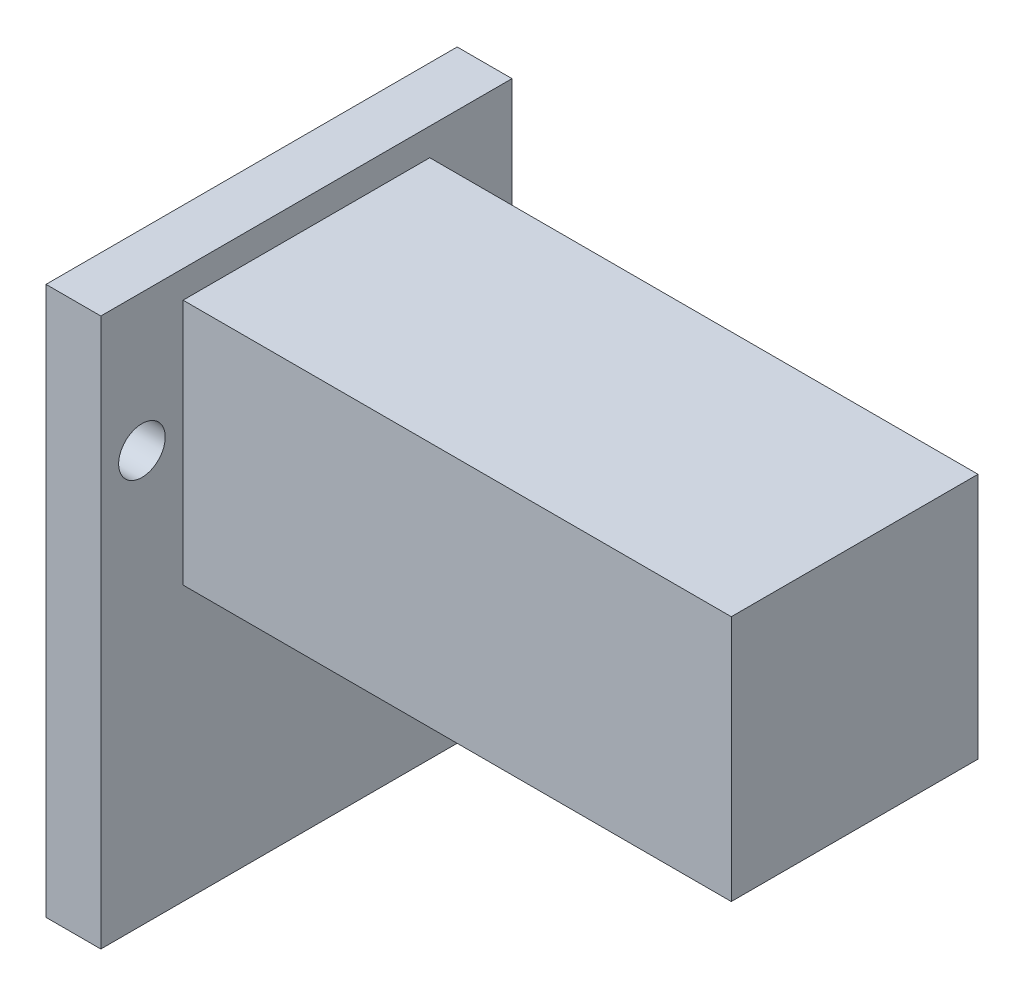
ISO-10303-21;
HEADER;
FILE_DESCRIPTION(('STEP AP214'),'2;1');
FILE_NAME('part.step','',(''),(''),'','','');
FILE_SCHEMA(('AUTOMOTIVE_DESIGN { 1 0 10303 214 1 1 1 1 }'));
ENDSEC;
DATA;
#1=APPLICATION_CONTEXT('core data for automotive mechanical design processes');
#2=APPLICATION_PROTOCOL_DEFINITION('international standard','automotive_design',2000,#1);
#3=PRODUCT_CONTEXT('',#1,'mechanical');
#4=PRODUCT('Part','Part','',(#3));
#5=PRODUCT_RELATED_PRODUCT_CATEGORY('part','',(#4));
#6=PRODUCT_DEFINITION_FORMATION('','',#4);
#7=PRODUCT_DEFINITION_CONTEXT('part definition',#1,'design');
#8=PRODUCT_DEFINITION('design','',#6,#7);
#9=PRODUCT_DEFINITION_SHAPE('','',#8);
#10=(LENGTH_UNIT() NAMED_UNIT(*) SI_UNIT(.MILLI.,.METRE.));
#11=(NAMED_UNIT(*) PLANE_ANGLE_UNIT() SI_UNIT($,.RADIAN.));
#12=(NAMED_UNIT(*) SI_UNIT($,.STERADIAN.) SOLID_ANGLE_UNIT());
#13=UNCERTAINTY_MEASURE_WITH_UNIT(LENGTH_MEASURE(1.E-05),#10,'distance_accuracy_value','');
#14=(GEOMETRIC_REPRESENTATION_CONTEXT(3) GLOBAL_UNCERTAINTY_ASSIGNED_CONTEXT((#13)) GLOBAL_UNIT_ASSIGNED_CONTEXT((#10,
#11,#12)) REPRESENTATION_CONTEXT('',''));
#15=CARTESIAN_POINT('',(0.,0.,0.));
#16=DIRECTION('',(0.,0.,1.));
#17=DIRECTION('',(1.,0.,0.));
#18=AXIS2_PLACEMENT_3D('',#15,#16,#17);
#19=CARTESIAN_POINT('',(4.,13.125,10.4166666666667));
#20=DIRECTION('',(0.,0.,-1.));
#21=DIRECTION('',(0.,1.,0.));
#22=AXIS2_PLACEMENT_3D('',#19,#20,#21);
#23=PLANE('',#22);
#24=DIRECTION('',(0.,-1.,0.));
#25=VECTOR('',#24,1.);
#26=CARTESIAN_POINT('',(0.,13.125,10.4166666666667));
#27=LINE('',#26,#25);
#28=CARTESIAN_POINT('',(0.,13.125,10.4166666666667));
#29=VERTEX_POINT('',#28);
#30=CARTESIAN_POINT('',(0.,-26.875,10.4166666666667));
#31=VERTEX_POINT('',#30);
#32=EDGE_CURVE('E123',#29,#31,#27,.T.);
#33=ORIENTED_EDGE('',*,*,#32,.T.);
#34=DIRECTION('',(-1.,0.,0.));
#35=VECTOR('',#34,1.);
#36=CARTESIAN_POINT('',(4.,-26.875,10.4166666666667));
#37=LINE('',#36,#35);
#38=CARTESIAN_POINT('',(4.,-26.875,10.4166666666667));
#39=VERTEX_POINT('',#38);
#40=EDGE_CURVE('E11',#39,#31,#37,.T.);
#41=ORIENTED_EDGE('',*,*,#40,.F.);
#42=DIRECTION('',(0.,-1.,0.));
#43=VECTOR('',#42,1.);
#44=CARTESIAN_POINT('',(4.,13.125,10.4166666666667));
#45=LINE('',#44,#43);
#46=CARTESIAN_POINT('',(4.,13.125,10.4166666666667));
#47=VERTEX_POINT('',#46);
#48=EDGE_CURVE('E133',#47,#39,#45,.T.);
#49=ORIENTED_EDGE('',*,*,#48,.F.);
#50=DIRECTION('',(-1.,0.,0.));
#51=VECTOR('',#50,1.);
#52=CARTESIAN_POINT('',(4.,13.125,10.4166666666667));
#53=LINE('',#52,#51);
#54=EDGE_CURVE('E141',#47,#29,#53,.T.);
#55=ORIENTED_EDGE('',*,*,#54,.T.);
#56=EDGE_LOOP('',(#33,#41,#49,#55));
#57=FACE_BOUND('',#56,.T.);
#58=ADVANCED_FACE('F41',(#57),#23,.F.);
#59=CARTESIAN_POINT('',(4.,-26.875,10.4166666666667));
#60=DIRECTION('',(0.,1.,0.));
#61=DIRECTION('',(0.,0.,1.));
#62=AXIS2_PLACEMENT_3D('',#59,#60,#61);
#63=PLANE('',#62);
#64=DIRECTION('',(0.,0.,-1.));
#65=VECTOR('',#64,1.);
#66=CARTESIAN_POINT('',(0.,-26.875,10.4166666666667));
#67=LINE('',#66,#65);
#68=CARTESIAN_POINT('',(0.,-26.875,-19.5833333333333));
#69=VERTEX_POINT('',#68);
#70=EDGE_CURVE('E126',#31,#69,#67,.T.);
#71=ORIENTED_EDGE('',*,*,#70,.T.);
#72=DIRECTION('',(-1.,0.,0.));
#73=VECTOR('',#72,1.);
#74=CARTESIAN_POINT('',(4.,-26.875,-19.5833333333333));
#75=LINE('',#74,#73);
#76=CARTESIAN_POINT('',(4.,-26.875,-19.5833333333333));
#77=VERTEX_POINT('',#76);
#78=EDGE_CURVE('E48',#77,#69,#75,.T.);
#79=ORIENTED_EDGE('',*,*,#78,.F.);
#80=DIRECTION('',(0.,0.,-1.));
#81=VECTOR('',#80,1.);
#82=CARTESIAN_POINT('',(4.,-26.875,10.4166666666667));
#83=LINE('',#82,#81);
#84=EDGE_CURVE('E140',#39,#77,#83,.T.);
#85=ORIENTED_EDGE('',*,*,#84,.F.);
#86=ORIENTED_EDGE('',*,*,#40,.T.);
#87=EDGE_LOOP('',(#71,#79,#85,#86));
#88=FACE_BOUND('',#87,.T.);
#89=ADVANCED_FACE('F173',(#88),#63,.F.);
#90=CARTESIAN_POINT('',(4.,13.125,-19.5833333333333));
#91=DIRECTION('',(0.,0.,1.));
#92=DIRECTION('',(0.,-1.,0.));
#93=AXIS2_PLACEMENT_3D('',#90,#91,#92);
#94=PLANE('',#93);
#95=DIRECTION('',(0.,1.,0.));
#96=VECTOR('',#95,1.);
#97=CARTESIAN_POINT('',(0.,13.125,-19.5833333333333));
#98=LINE('',#97,#96);
#99=CARTESIAN_POINT('',(0.,13.125,-19.5833333333333));
#100=VERTEX_POINT('',#99);
#101=EDGE_CURVE('E148',#69,#100,#98,.T.);
#102=ORIENTED_EDGE('',*,*,#101,.T.);
#103=DIRECTION('',(-1.,0.,0.));
#104=VECTOR('',#103,1.);
#105=CARTESIAN_POINT('',(4.,13.125,-19.5833333333333));
#106=LINE('',#105,#104);
#107=CARTESIAN_POINT('',(4.,13.125,-19.5833333333333));
#108=VERTEX_POINT('',#107);
#109=EDGE_CURVE('E151',#108,#100,#106,.T.);
#110=ORIENTED_EDGE('',*,*,#109,.F.);
#111=DIRECTION('',(0.,1.,0.));
#112=VECTOR('',#111,1.);
#113=CARTESIAN_POINT('',(4.,13.125,-19.5833333333333));
#114=LINE('',#113,#112);
#115=EDGE_CURVE('E138',#77,#108,#114,.T.);
#116=ORIENTED_EDGE('',*,*,#115,.F.);
#117=ORIENTED_EDGE('',*,*,#78,.T.);
#118=EDGE_LOOP('',(#102,#110,#116,#117));
#119=FACE_BOUND('',#118,.T.);
#120=ADVANCED_FACE('F158',(#119),#94,.F.);
#121=CARTESIAN_POINT('',(4.,13.125,10.4166666666667));
#122=DIRECTION('',(0.,-1.,0.));
#123=DIRECTION('',(0.,0.,-1.));
#124=AXIS2_PLACEMENT_3D('',#121,#122,#123);
#125=PLANE('',#124);
#126=DIRECTION('',(0.,0.,1.));
#127=VECTOR('',#126,1.);
#128=CARTESIAN_POINT('',(0.,13.125,10.4166666666667));
#129=LINE('',#128,#127);
#130=EDGE_CURVE('E139',#100,#29,#129,.T.);
#131=ORIENTED_EDGE('',*,*,#130,.T.);
#132=ORIENTED_EDGE('',*,*,#54,.F.);
#133=DIRECTION('',(0.,0.,1.));
#134=VECTOR('',#133,1.);
#135=CARTESIAN_POINT('',(4.,13.125,10.4166666666667));
#136=LINE('',#135,#134);
#137=EDGE_CURVE('E142',#108,#47,#136,.T.);
#138=ORIENTED_EDGE('',*,*,#137,.F.);
#139=ORIENTED_EDGE('',*,*,#109,.T.);
#140=EDGE_LOOP('',(#131,#132,#138,#139));
#141=FACE_BOUND('',#140,.T.);
#142=ADVANCED_FACE('F170',(#141),#125,.F.);
#143=CARTESIAN_POINT('',(4.,0.,0.));
#144=DIRECTION('',(1.,0.,0.));
#145=DIRECTION('',(0.,0.,-1.));
#146=AXIS2_PLACEMENT_3D('',#143,#144,#145);
#147=PLANE('',#146);
#148=CARTESIAN_POINT('',(4.,3.125,7.41666666666667));
#149=DIRECTION('',(1.,0.,0.));
#150=DIRECTION('',(0.,0.,-1.));
#151=AXIS2_PLACEMENT_3D('',#148,#149,#150);
#152=CIRCLE('',#151,1.7);
#153=CARTESIAN_POINT('',(4.,3.125,5.71666666666667));
#154=VERTEX_POINT('',#153);
#155=EDGE_CURVE('E218',#154,#154,#152,.T.);
#156=ORIENTED_EDGE('',*,*,#155,.F.);
#157=EDGE_LOOP('',(#156));
#158=FACE_BOUND('',#157,.T.);
#159=CARTESIAN_POINT('',(4.,3.125,-16.5833333333333));
#160=DIRECTION('',(1.,0.,0.));
#161=DIRECTION('',(0.,0.,-1.));
#162=AXIS2_PLACEMENT_3D('',#159,#160,#161);
#163=CIRCLE('',#162,1.7);
#164=CARTESIAN_POINT('',(4.,3.125,-18.2833333333333));
#165=VERTEX_POINT('',#164);
#166=EDGE_CURVE('E219',#165,#165,#163,.T.);
#167=ORIENTED_EDGE('',*,*,#166,.F.);
#168=EDGE_LOOP('',(#167));
#169=FACE_BOUND('',#168,.T.);
#170=DIRECTION('',(0.,-1.,0.));
#171=VECTOR('',#170,1.);
#172=CARTESIAN_POINT('',(4.,11.125,4.41666666666667));
#173=LINE('',#172,#171);
#174=CARTESIAN_POINT('',(4.,11.125,4.41666666666667));
#175=VERTEX_POINT('',#174);
#176=CARTESIAN_POINT('',(4.,-6.875,4.41666666666666));
#177=VERTEX_POINT('',#176);
#178=EDGE_CURVE('E54',#175,#177,#173,.T.);
#179=ORIENTED_EDGE('',*,*,#178,.F.);
#180=DIRECTION('',(0.,0.,1.));
#181=VECTOR('',#180,1.);
#182=CARTESIAN_POINT('',(4.,11.125,4.41666666666667));
#183=LINE('',#182,#181);
#184=CARTESIAN_POINT('',(4.,11.125,-13.5833333333333));
#185=VERTEX_POINT('',#184);
#186=EDGE_CURVE('E56',#185,#175,#183,.T.);
#187=ORIENTED_EDGE('',*,*,#186,.F.);
#188=DIRECTION('',(0.,1.,0.));
#189=VECTOR('',#188,1.);
#190=CARTESIAN_POINT('',(4.,11.125,-13.5833333333333));
#191=LINE('',#190,#189);
#192=CARTESIAN_POINT('',(4.,-6.875,-13.5833333333333));
#193=VERTEX_POINT('',#192);
#194=EDGE_CURVE('E233',#193,#185,#191,.T.);
#195=ORIENTED_EDGE('',*,*,#194,.F.);
#196=DIRECTION('',(0.,0.,-1.));
#197=VECTOR('',#196,1.);
#198=CARTESIAN_POINT('',(4.,-6.875,4.41666666666666));
#199=LINE('',#198,#197);
#200=EDGE_CURVE('E234',#177,#193,#199,.T.);
#201=ORIENTED_EDGE('',*,*,#200,.F.);
#202=EDGE_LOOP('',(#179,#187,#195,#201));
#203=FACE_BOUND('',#202,.T.);
#204=ORIENTED_EDGE('',*,*,#48,.T.);
#205=ORIENTED_EDGE('',*,*,#84,.T.);
#206=ORIENTED_EDGE('',*,*,#115,.T.);
#207=ORIENTED_EDGE('',*,*,#137,.T.);
#208=EDGE_LOOP('',(#204,#205,#206,#207));
#209=FACE_BOUND('',#208,.T.);
#210=ADVANCED_FACE('F175',(#158,#169,#203,#209),#147,.T.);
#211=CARTESIAN_POINT('',(0.,0.,0.));
#212=DIRECTION('',(1.,0.,0.));
#213=DIRECTION('',(0.,0.,-1.));
#214=AXIS2_PLACEMENT_3D('',#211,#212,#213);
#215=PLANE('',#214);
#216=CARTESIAN_POINT('',(0.,3.125,7.41666666666667));
#217=DIRECTION('',(1.,0.,0.));
#218=DIRECTION('',(0.,0.,-1.));
#219=AXIS2_PLACEMENT_3D('',#216,#217,#218);
#220=CIRCLE('',#219,1.7);
#221=CARTESIAN_POINT('',(0.,3.125,5.71666666666667));
#222=VERTEX_POINT('',#221);
#223=EDGE_CURVE('E216',#222,#222,#220,.T.);
#224=ORIENTED_EDGE('',*,*,#223,.T.);
#225=EDGE_LOOP('',(#224));
#226=FACE_BOUND('',#225,.T.);
#227=CARTESIAN_POINT('',(0.,3.125,-16.5833333333333));
#228=DIRECTION('',(1.,0.,0.));
#229=DIRECTION('',(0.,0.,-1.));
#230=AXIS2_PLACEMENT_3D('',#227,#228,#229);
#231=CIRCLE('',#230,1.7);
#232=CARTESIAN_POINT('',(0.,3.125,-18.2833333333333));
#233=VERTEX_POINT('',#232);
#234=EDGE_CURVE('E221',#233,#233,#231,.T.);
#235=ORIENTED_EDGE('',*,*,#234,.T.);
#236=EDGE_LOOP('',(#235));
#237=FACE_BOUND('',#236,.T.);
#238=ORIENTED_EDGE('',*,*,#32,.F.);
#239=ORIENTED_EDGE('',*,*,#130,.F.);
#240=ORIENTED_EDGE('',*,*,#101,.F.);
#241=ORIENTED_EDGE('',*,*,#70,.F.);
#242=EDGE_LOOP('',(#238,#239,#240,#241));
#243=FACE_BOUND('',#242,.T.);
#244=ADVANCED_FACE('F163',(#226,#237,#243),#215,.F.);
#245=CARTESIAN_POINT('',(44.,11.125,4.41666666666667));
#246=DIRECTION('',(0.,0.,-1.));
#247=DIRECTION('',(0.,1.,0.));
#248=AXIS2_PLACEMENT_3D('',#245,#246,#247);
#249=PLANE('',#248);
#250=ORIENTED_EDGE('',*,*,#178,.T.);
#251=DIRECTION('',(-1.,0.,0.));
#252=VECTOR('',#251,1.);
#253=CARTESIAN_POINT('',(44.,-6.875,4.41666666666666));
#254=LINE('',#253,#252);
#255=CARTESIAN_POINT('',(44.,-6.875,4.41666666666666));
#256=VERTEX_POINT('',#255);
#257=EDGE_CURVE('E107',#256,#177,#254,.T.);
#258=ORIENTED_EDGE('',*,*,#257,.F.);
#259=DIRECTION('',(0.,-1.,0.));
#260=VECTOR('',#259,1.);
#261=CARTESIAN_POINT('',(44.,11.125,4.41666666666667));
#262=LINE('',#261,#260);
#263=CARTESIAN_POINT('',(44.,11.125,4.41666666666667));
#264=VERTEX_POINT('',#263);
#265=EDGE_CURVE('E111',#264,#256,#262,.T.);
#266=ORIENTED_EDGE('',*,*,#265,.F.);
#267=DIRECTION('',(-1.,0.,0.));
#268=VECTOR('',#267,1.);
#269=CARTESIAN_POINT('',(44.,11.125,4.41666666666667));
#270=LINE('',#269,#268);
#271=EDGE_CURVE('E232',#264,#175,#270,.T.);
#272=ORIENTED_EDGE('',*,*,#271,.T.);
#273=EDGE_LOOP('',(#250,#258,#266,#272));
#274=FACE_BOUND('',#273,.T.);
#275=ADVANCED_FACE('F121',(#274),#249,.F.);
#276=CARTESIAN_POINT('',(44.,-6.875,4.41666666666666));
#277=DIRECTION('',(0.,1.,0.));
#278=DIRECTION('',(0.,0.,1.));
#279=AXIS2_PLACEMENT_3D('',#276,#277,#278);
#280=PLANE('',#279);
#281=ORIENTED_EDGE('',*,*,#200,.T.);
#282=DIRECTION('',(-1.,0.,0.));
#283=VECTOR('',#282,1.);
#284=CARTESIAN_POINT('',(44.,-6.875,-13.5833333333333));
#285=LINE('',#284,#283);
#286=CARTESIAN_POINT('',(44.,-6.875,-13.5833333333333));
#287=VERTEX_POINT('',#286);
#288=EDGE_CURVE('E109',#287,#193,#285,.T.);
#289=ORIENTED_EDGE('',*,*,#288,.F.);
#290=DIRECTION('',(0.,0.,-1.));
#291=VECTOR('',#290,1.);
#292=CARTESIAN_POINT('',(44.,-6.875,4.41666666666666));
#293=LINE('',#292,#291);
#294=EDGE_CURVE('E103',#256,#287,#293,.T.);
#295=ORIENTED_EDGE('',*,*,#294,.F.);
#296=ORIENTED_EDGE('',*,*,#257,.T.);
#297=EDGE_LOOP('',(#281,#289,#295,#296));
#298=FACE_BOUND('',#297,.T.);
#299=ADVANCED_FACE('F106',(#298),#280,.F.);
#300=CARTESIAN_POINT('',(44.,11.125,-13.5833333333333));
#301=DIRECTION('',(0.,0.,1.));
#302=DIRECTION('',(0.,-1.,0.));
#303=AXIS2_PLACEMENT_3D('',#300,#301,#302);
#304=PLANE('',#303);
#305=ORIENTED_EDGE('',*,*,#194,.T.);
#306=DIRECTION('',(-1.,0.,0.));
#307=VECTOR('',#306,1.);
#308=CARTESIAN_POINT('',(44.,11.125,-13.5833333333333));
#309=LINE('',#308,#307);
#310=CARTESIAN_POINT('',(44.,11.125,-13.5833333333333));
#311=VERTEX_POINT('',#310);
#312=EDGE_CURVE('E128',#311,#185,#309,.T.);
#313=ORIENTED_EDGE('',*,*,#312,.F.);
#314=DIRECTION('',(0.,1.,0.));
#315=VECTOR('',#314,1.);
#316=CARTESIAN_POINT('',(44.,11.125,-13.5833333333333));
#317=LINE('',#316,#315);
#318=EDGE_CURVE('E114',#287,#311,#317,.T.);
#319=ORIENTED_EDGE('',*,*,#318,.F.);
#320=ORIENTED_EDGE('',*,*,#288,.T.);
#321=EDGE_LOOP('',(#305,#313,#319,#320));
#322=FACE_BOUND('',#321,.T.);
#323=ADVANCED_FACE('F191',(#322),#304,.F.);
#324=CARTESIAN_POINT('',(44.,11.125,4.41666666666667));
#325=DIRECTION('',(0.,-1.,0.));
#326=DIRECTION('',(0.,0.,-1.));
#327=AXIS2_PLACEMENT_3D('',#324,#325,#326);
#328=PLANE('',#327);
#329=ORIENTED_EDGE('',*,*,#186,.T.);
#330=ORIENTED_EDGE('',*,*,#271,.F.);
#331=DIRECTION('',(0.,0.,1.));
#332=VECTOR('',#331,1.);
#333=CARTESIAN_POINT('',(44.,11.125,4.41666666666667));
#334=LINE('',#333,#332);
#335=EDGE_CURVE('E118',#311,#264,#334,.T.);
#336=ORIENTED_EDGE('',*,*,#335,.F.);
#337=ORIENTED_EDGE('',*,*,#312,.T.);
#338=EDGE_LOOP('',(#329,#330,#336,#337));
#339=FACE_BOUND('',#338,.T.);
#340=ADVANCED_FACE('F197',(#339),#328,.F.);
#341=CARTESIAN_POINT('',(44.,0.,0.));
#342=DIRECTION('',(1.,0.,0.));
#343=DIRECTION('',(0.,0.,-1.));
#344=AXIS2_PLACEMENT_3D('',#341,#342,#343);
#345=PLANE('',#344);
#346=ORIENTED_EDGE('',*,*,#265,.T.);
#347=ORIENTED_EDGE('',*,*,#294,.T.);
#348=ORIENTED_EDGE('',*,*,#318,.T.);
#349=ORIENTED_EDGE('',*,*,#335,.T.);
#350=EDGE_LOOP('',(#346,#347,#348,#349));
#351=FACE_BOUND('',#350,.T.);
#352=ADVANCED_FACE('F116',(#351),#345,.T.);
#353=CARTESIAN_POINT('',(0.,3.125,-16.5833333333333));
#354=DIRECTION('',(1.,0.,0.));
#355=DIRECTION('',(0.,0.,-1.));
#356=AXIS2_PLACEMENT_3D('',#353,#354,#355);
#357=CYLINDRICAL_SURFACE('',#356,1.7);
#358=ORIENTED_EDGE('',*,*,#234,.F.);
#359=EDGE_LOOP('',(#358));
#360=FACE_BOUND('',#359,.T.);
#361=ORIENTED_EDGE('',*,*,#166,.T.);
#362=EDGE_LOOP('',(#361));
#363=FACE_BOUND('',#362,.T.);
#364=ADVANCED_FACE('F204',(#360,#363),#357,.F.);
#365=CARTESIAN_POINT('',(0.,3.125,7.41666666666667));
#366=DIRECTION('',(1.,0.,0.));
#367=DIRECTION('',(0.,0.,-1.));
#368=AXIS2_PLACEMENT_3D('',#365,#366,#367);
#369=CYLINDRICAL_SURFACE('',#368,1.7);
#370=ORIENTED_EDGE('',*,*,#223,.F.);
#371=EDGE_LOOP('',(#370));
#372=FACE_BOUND('',#371,.T.);
#373=ORIENTED_EDGE('',*,*,#155,.T.);
#374=EDGE_LOOP('',(#373));
#375=FACE_BOUND('',#374,.T.);
#376=ADVANCED_FACE('F210',(#372,#375),#369,.F.);
#377=CLOSED_SHELL('',(#58,#89,#120,#142,#210,#244,#275,#299,#323,#340,#352,#364,#376));
#378=MANIFOLD_SOLID_BREP('B2',#377);
#379=ADVANCED_BREP_SHAPE_REPRESENTATION('',(#18,#378),#14);
#380=SHAPE_DEFINITION_REPRESENTATION(#9,#379);
ENDSEC;
END-ISO-10303-21;
